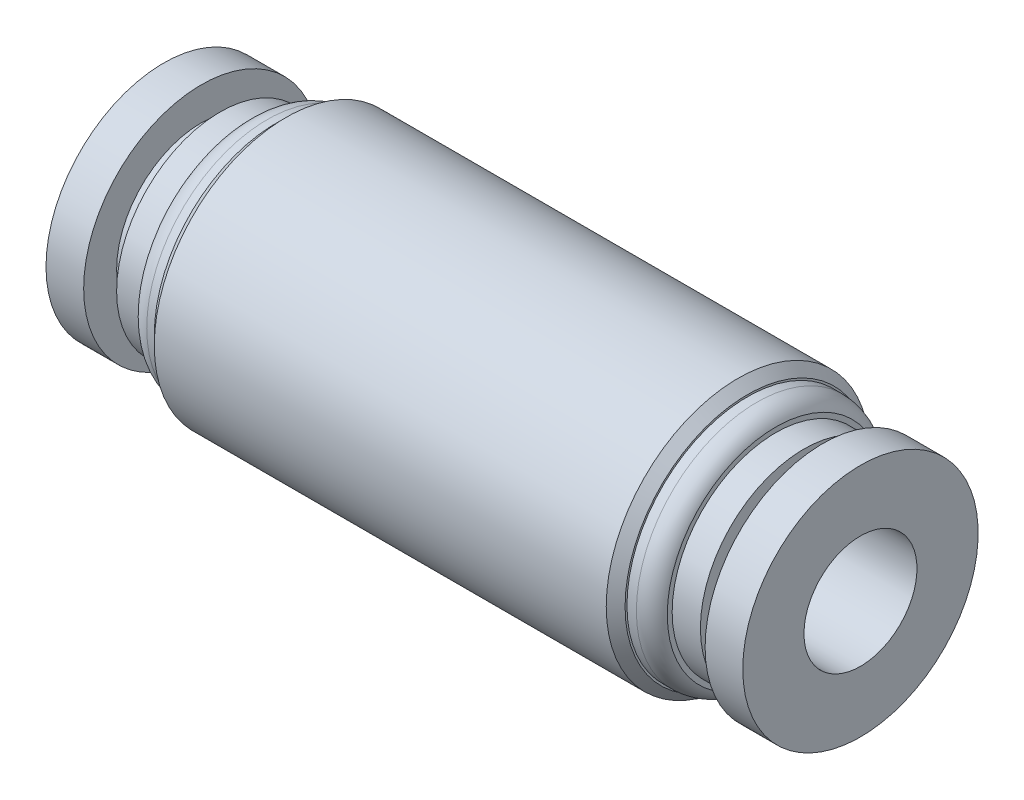
ISO-10303-21;
HEADER;
FILE_DESCRIPTION(('STEP AP214'),'2;1');
FILE_NAME('part.step','',(''),(''),'','','');
FILE_SCHEMA(('AUTOMOTIVE_DESIGN { 1 0 10303 214 1 1 1 1 }'));
ENDSEC;
DATA;
#1=APPLICATION_CONTEXT('core data for automotive mechanical design processes');
#2=APPLICATION_PROTOCOL_DEFINITION('international standard','automotive_design',2000,#1);
#3=PRODUCT_CONTEXT('',#1,'mechanical');
#4=PRODUCT('Part','Part','',(#3));
#5=PRODUCT_RELATED_PRODUCT_CATEGORY('part','',(#4));
#6=PRODUCT_DEFINITION_FORMATION('','',#4);
#7=PRODUCT_DEFINITION_CONTEXT('part definition',#1,'design');
#8=PRODUCT_DEFINITION('design','',#6,#7);
#9=PRODUCT_DEFINITION_SHAPE('','',#8);
#10=(LENGTH_UNIT() NAMED_UNIT(*) SI_UNIT(.MILLI.,.METRE.));
#11=(NAMED_UNIT(*) PLANE_ANGLE_UNIT() SI_UNIT($,.RADIAN.));
#12=(NAMED_UNIT(*) SI_UNIT($,.STERADIAN.) SOLID_ANGLE_UNIT());
#13=UNCERTAINTY_MEASURE_WITH_UNIT(LENGTH_MEASURE(1.E-05),#10,'distance_accuracy_value','');
#14=(GEOMETRIC_REPRESENTATION_CONTEXT(3) GLOBAL_UNCERTAINTY_ASSIGNED_CONTEXT((#13)) GLOBAL_UNIT_ASSIGNED_CONTEXT((#10,
#11,#12)) REPRESENTATION_CONTEXT('',''));
#15=CARTESIAN_POINT('',(0.,0.,0.));
#16=DIRECTION('',(0.,0.,1.));
#17=DIRECTION('',(1.,0.,0.));
#18=AXIS2_PLACEMENT_3D('',#15,#16,#17);
#19=CARTESIAN_POINT('',(-37.3771865118549,0.,0.));
#20=DIRECTION('',(-1.,0.,0.));
#21=DIRECTION('',(0.,0.,1.));
#22=AXIS2_PLACEMENT_3D('',#19,#20,#21);
#23=CYLINDRICAL_SURFACE('',#22,3.);
#24=CARTESIAN_POINT('',(18.5,0.,0.));
#25=DIRECTION('',(-1.,0.,0.));
#26=DIRECTION('',(0.,0.,1.));
#27=AXIS2_PLACEMENT_3D('',#24,#25,#26);
#28=CIRCLE('',#27,3.);
#29=CARTESIAN_POINT('',(18.5,0.,3.));
#30=VERTEX_POINT('',#29);
#31=EDGE_CURVE('E74',#30,#30,#28,.T.);
#32=ORIENTED_EDGE('',*,*,#31,.F.);
#33=EDGE_LOOP('',(#32));
#34=FACE_BOUND('',#33,.T.);
#35=CARTESIAN_POINT('',(-18.5,0.,0.));
#36=DIRECTION('',(-1.,0.,0.));
#37=DIRECTION('',(0.,0.,1.));
#38=AXIS2_PLACEMENT_3D('',#35,#36,#37);
#39=CIRCLE('',#38,3.);
#40=CARTESIAN_POINT('',(-18.5,0.,3.));
#41=VERTEX_POINT('',#40);
#42=EDGE_CURVE('E140',#41,#41,#39,.T.);
#43=ORIENTED_EDGE('',*,*,#42,.T.);
#44=EDGE_LOOP('',(#43));
#45=FACE_BOUND('',#44,.T.);
#46=ADVANCED_FACE('F48',(#34,#45),#23,.F.);
#47=CARTESIAN_POINT('',(18.5,0.,-6.25));
#48=DIRECTION('',(-1.,0.,0.));
#49=DIRECTION('',(0.,0.,1.));
#50=AXIS2_PLACEMENT_3D('',#47,#48,#49);
#51=PLANE('',#50);
#52=CARTESIAN_POINT('',(18.5,0.,0.));
#53=DIRECTION('',(-1.,0.,0.));
#54=DIRECTION('',(0.,0.,1.));
#55=AXIS2_PLACEMENT_3D('',#52,#53,#54);
#56=CIRCLE('',#55,6.25);
#57=CARTESIAN_POINT('',(18.5,0.,6.25));
#58=VERTEX_POINT('',#57);
#59=EDGE_CURVE('E77',#58,#58,#56,.T.);
#60=ORIENTED_EDGE('',*,*,#59,.F.);
#61=EDGE_LOOP('',(#60));
#62=FACE_BOUND('',#61,.T.);
#63=ORIENTED_EDGE('',*,*,#31,.T.);
#64=EDGE_LOOP('',(#63));
#65=FACE_BOUND('',#64,.T.);
#66=ADVANCED_FACE('F211',(#62,#65),#51,.F.);
#67=CARTESIAN_POINT('',(-37.3771865118549,0.,0.));
#68=DIRECTION('',(-1.,0.,0.));
#69=DIRECTION('',(0.,0.,1.));
#70=AXIS2_PLACEMENT_3D('',#67,#68,#69);
#71=CYLINDRICAL_SURFACE('',#70,6.25);
#72=CARTESIAN_POINT('',(16.5,0.,0.));
#73=DIRECTION('',(-1.,0.,0.));
#74=DIRECTION('',(0.,0.,1.));
#75=AXIS2_PLACEMENT_3D('',#72,#73,#74);
#76=CIRCLE('',#75,6.25);
#77=CARTESIAN_POINT('',(16.5,0.,6.25));
#78=VERTEX_POINT('',#77);
#79=EDGE_CURVE('E81',#78,#78,#76,.T.);
#80=ORIENTED_EDGE('',*,*,#79,.F.);
#81=EDGE_LOOP('',(#80));
#82=FACE_BOUND('',#81,.T.);
#83=ORIENTED_EDGE('',*,*,#59,.T.);
#84=EDGE_LOOP('',(#83));
#85=FACE_BOUND('',#84,.T.);
#86=ADVANCED_FACE('F217',(#82,#85),#71,.T.);
#87=CARTESIAN_POINT('',(16.5,0.,-4.5));
#88=DIRECTION('',(1.,0.,0.));
#89=DIRECTION('',(0.,0.,-1.));
#90=AXIS2_PLACEMENT_3D('',#87,#88,#89);
#91=PLANE('',#90);
#92=CARTESIAN_POINT('',(16.5,0.,0.));
#93=DIRECTION('',(-1.,0.,0.));
#94=DIRECTION('',(0.,0.,1.));
#95=AXIS2_PLACEMENT_3D('',#92,#93,#94);
#96=CIRCLE('',#95,4.5);
#97=CARTESIAN_POINT('',(16.5,0.,4.5));
#98=VERTEX_POINT('',#97);
#99=EDGE_CURVE('E85',#98,#98,#96,.T.);
#100=ORIENTED_EDGE('',*,*,#99,.F.);
#101=EDGE_LOOP('',(#100));
#102=FACE_BOUND('',#101,.T.);
#103=ORIENTED_EDGE('',*,*,#79,.T.);
#104=EDGE_LOOP('',(#103));
#105=FACE_BOUND('',#104,.T.);
#106=ADVANCED_FACE('F248',(#102,#105),#91,.F.);
#107=CARTESIAN_POINT('',(-37.3771865118549,0.,0.));
#108=DIRECTION('',(-1.,0.,0.));
#109=DIRECTION('',(0.,0.,1.));
#110=AXIS2_PLACEMENT_3D('',#107,#108,#109);
#111=CYLINDRICAL_SURFACE('',#110,4.5);
#112=CARTESIAN_POINT('',(15.5,0.,0.));
#113=DIRECTION('',(-1.,0.,0.));
#114=DIRECTION('',(0.,0.,1.));
#115=AXIS2_PLACEMENT_3D('',#112,#113,#114);
#116=CIRCLE('',#115,4.5);
#117=CARTESIAN_POINT('',(15.5,0.,4.5));
#118=VERTEX_POINT('',#117);
#119=EDGE_CURVE('E88',#118,#118,#116,.T.);
#120=ORIENTED_EDGE('',*,*,#119,.F.);
#121=EDGE_LOOP('',(#120));
#122=FACE_BOUND('',#121,.T.);
#123=ORIENTED_EDGE('',*,*,#99,.T.);
#124=EDGE_LOOP('',(#123));
#125=FACE_BOUND('',#124,.T.);
#126=ADVANCED_FACE('F291',(#122,#125),#111,.T.);
#127=CARTESIAN_POINT('',(15.5,0.,-5.5));
#128=DIRECTION('',(-1.,0.,0.));
#129=DIRECTION('',(0.,0.,1.));
#130=AXIS2_PLACEMENT_3D('',#127,#128,#129);
#131=PLANE('',#130);
#132=CARTESIAN_POINT('',(15.5,0.,0.));
#133=DIRECTION('',(-1.,0.,0.));
#134=DIRECTION('',(0.,0.,1.));
#135=AXIS2_PLACEMENT_3D('',#132,#133,#134);
#136=CIRCLE('',#135,5.5);
#137=CARTESIAN_POINT('',(15.5,0.,5.5));
#138=VERTEX_POINT('',#137);
#139=EDGE_CURVE('E91',#138,#138,#136,.T.);
#140=ORIENTED_EDGE('',*,*,#139,.F.);
#141=EDGE_LOOP('',(#140));
#142=FACE_BOUND('',#141,.T.);
#143=ORIENTED_EDGE('',*,*,#119,.T.);
#144=EDGE_LOOP('',(#143));
#145=FACE_BOUND('',#144,.T.);
#146=ADVANCED_FACE('F295',(#142,#145),#131,.F.);
#147=CARTESIAN_POINT('',(-37.3771865118549,0.,0.));
#148=DIRECTION('',(-1.,0.,0.));
#149=DIRECTION('',(0.,0.,1.));
#150=AXIS2_PLACEMENT_3D('',#147,#148,#149);
#151=CYLINDRICAL_SURFACE('',#150,5.5);
#152=CARTESIAN_POINT('',(14.,0.,0.));
#153=DIRECTION('',(-1.,0.,0.));
#154=DIRECTION('',(0.,0.,1.));
#155=AXIS2_PLACEMENT_3D('',#152,#153,#154);
#156=CIRCLE('',#155,5.5);
#157=CARTESIAN_POINT('',(14.,0.,5.5));
#158=VERTEX_POINT('',#157);
#159=EDGE_CURVE('E95',#158,#158,#156,.T.);
#160=ORIENTED_EDGE('',*,*,#159,.F.);
#161=EDGE_LOOP('',(#160));
#162=FACE_BOUND('',#161,.T.);
#163=ORIENTED_EDGE('',*,*,#139,.T.);
#164=EDGE_LOOP('',(#163));
#165=FACE_BOUND('',#164,.T.);
#166=ADVANCED_FACE('F328',(#162,#165),#151,.T.);
#167=CARTESIAN_POINT('',(14.,0.,-5.7582575694956));
#168=DIRECTION('',(-1.,0.,0.));
#169=DIRECTION('',(0.,0.,1.));
#170=AXIS2_PLACEMENT_3D('',#167,#168,#169);
#171=PLANE('',#170);
#172=CARTESIAN_POINT('',(14.,0.,0.));
#173=DIRECTION('',(-1.,0.,0.));
#174=DIRECTION('',(0.,0.,1.));
#175=AXIS2_PLACEMENT_3D('',#172,#173,#174);
#176=CIRCLE('',#175,5.7582575694956);
#177=CARTESIAN_POINT('',(14.,0.,5.7582575694956));
#178=VERTEX_POINT('',#177);
#179=EDGE_CURVE('E98',#178,#178,#176,.T.);
#180=ORIENTED_EDGE('',*,*,#179,.F.);
#181=EDGE_LOOP('',(#180));
#182=FACE_BOUND('',#181,.T.);
#183=ORIENTED_EDGE('',*,*,#159,.T.);
#184=EDGE_LOOP('',(#183));
#185=FACE_BOUND('',#184,.T.);
#186=ADVANCED_FACE('F270',(#182,#185),#171,.F.);
#187=CARTESIAN_POINT('',(13.,0.,0.));
#188=DIRECTION('',(-1.,0.,0.));
#189=DIRECTION('',(0.,0.,1.));
#190=AXIS2_PLACEMENT_3D('',#187,#188,#189);
#191=TOROIDAL_SURFACE('',#190,5.30000000000001,1.1);
#192=CARTESIAN_POINT('',(13.,0.,0.));
#193=DIRECTION('',(-1.,0.,0.));
#194=DIRECTION('',(0.,0.,1.));
#195=AXIS2_PLACEMENT_3D('',#192,#193,#194);
#196=CIRCLE('',#195,6.4);
#197=CARTESIAN_POINT('',(13.,0.,6.4));
#198=VERTEX_POINT('',#197);
#199=EDGE_CURVE('E102',#198,#198,#196,.T.);
#200=ORIENTED_EDGE('',*,*,#199,.F.);
#201=EDGE_LOOP('',(#200));
#202=FACE_BOUND('',#201,.T.);
#203=ORIENTED_EDGE('',*,*,#179,.T.);
#204=EDGE_LOOP('',(#203));
#205=FACE_BOUND('',#204,.T.);
#206=ADVANCED_FACE('F265',(#202,#205),#191,.T.);
#207=CARTESIAN_POINT('',(-37.3771865118549,0.,0.));
#208=DIRECTION('',(-1.,0.,0.));
#209=DIRECTION('',(0.,0.,1.));
#210=AXIS2_PLACEMENT_3D('',#207,#208,#209);
#211=CYLINDRICAL_SURFACE('',#210,6.4);
#212=CARTESIAN_POINT('',(12.5,0.,0.));
#213=DIRECTION('',(-1.,0.,0.));
#214=DIRECTION('',(0.,0.,1.));
#215=AXIS2_PLACEMENT_3D('',#212,#213,#214);
#216=CIRCLE('',#215,6.4);
#217=CARTESIAN_POINT('',(12.5,0.,6.4));
#218=VERTEX_POINT('',#217);
#219=EDGE_CURVE('E106',#218,#218,#216,.T.);
#220=ORIENTED_EDGE('',*,*,#219,.F.);
#221=EDGE_LOOP('',(#220));
#222=FACE_BOUND('',#221,.T.);
#223=ORIENTED_EDGE('',*,*,#199,.T.);
#224=EDGE_LOOP('',(#223));
#225=FACE_BOUND('',#224,.T.);
#226=ADVANCED_FACE('F269',(#222,#225),#211,.T.);
#227=CARTESIAN_POINT('',(12.5,0.,-7.));
#228=DIRECTION('',(-1.,0.,0.));
#229=DIRECTION('',(0.,0.,1.));
#230=AXIS2_PLACEMENT_3D('',#227,#228,#229);
#231=PLANE('',#230);
#232=CARTESIAN_POINT('',(12.5,0.,0.));
#233=DIRECTION('',(-1.,0.,0.));
#234=DIRECTION('',(0.,0.,1.));
#235=AXIS2_PLACEMENT_3D('',#232,#233,#234);
#236=CIRCLE('',#235,6.49999999999998);
#237=CARTESIAN_POINT('',(12.5,0.,6.49999999999998));
#238=VERTEX_POINT('',#237);
#239=EDGE_CURVE('E55',#238,#238,#236,.F.);
#240=ORIENTED_EDGE('',*,*,#239,.T.);
#241=EDGE_LOOP('',(#240));
#242=FACE_BOUND('',#241,.T.);
#243=ORIENTED_EDGE('',*,*,#219,.T.);
#244=EDGE_LOOP('',(#243));
#245=FACE_BOUND('',#244,.T.);
#246=ADVANCED_FACE('F207',(#242,#245),#231,.F.);
#247=CARTESIAN_POINT('',(-37.3771865118549,0.,0.));
#248=DIRECTION('',(-1.,0.,0.));
#249=DIRECTION('',(0.,0.,1.));
#250=AXIS2_PLACEMENT_3D('',#247,#248,#249);
#251=CYLINDRICAL_SURFACE('',#250,7.);
#252=CARTESIAN_POINT('',(12.,0.,0.));
#253=DIRECTION('',(-1.,0.,0.));
#254=DIRECTION('',(0.,0.,1.));
#255=AXIS2_PLACEMENT_3D('',#252,#253,#254);
#256=CIRCLE('',#255,7.);
#257=CARTESIAN_POINT('',(12.,0.,7.));
#258=VERTEX_POINT('',#257);
#259=EDGE_CURVE('E60',#258,#258,#256,.T.);
#260=ORIENTED_EDGE('',*,*,#259,.T.);
#261=EDGE_LOOP('',(#260));
#262=FACE_BOUND('',#261,.T.);
#263=CARTESIAN_POINT('',(-12.,0.,0.));
#264=DIRECTION('',(1.,0.,0.));
#265=DIRECTION('',(0.,0.,-1.));
#266=AXIS2_PLACEMENT_3D('',#263,#264,#265);
#267=CIRCLE('',#266,7.);
#268=CARTESIAN_POINT('',(-12.,0.,-7.));
#269=VERTEX_POINT('',#268);
#270=EDGE_CURVE('E68',#269,#269,#267,.T.);
#271=ORIENTED_EDGE('',*,*,#270,.T.);
#272=EDGE_LOOP('',(#271));
#273=FACE_BOUND('',#272,.T.);
#274=ADVANCED_FACE('F202',(#262,#273),#251,.T.);
#275=CARTESIAN_POINT('',(-12.5,0.,-7.));
#276=DIRECTION('',(1.,0.,0.));
#277=DIRECTION('',(0.,0.,-1.));
#278=AXIS2_PLACEMENT_3D('',#275,#276,#277);
#279=PLANE('',#278);
#280=CARTESIAN_POINT('',(-12.5,0.,0.));
#281=DIRECTION('',(1.,0.,0.));
#282=DIRECTION('',(0.,0.,-1.));
#283=AXIS2_PLACEMENT_3D('',#280,#281,#282);
#284=CIRCLE('',#283,6.49999999999999);
#285=CARTESIAN_POINT('',(-12.5,0.,-6.49999999999999));
#286=VERTEX_POINT('',#285);
#287=EDGE_CURVE('E12',#286,#286,#284,.F.);
#288=ORIENTED_EDGE('',*,*,#287,.T.);
#289=EDGE_LOOP('',(#288));
#290=FACE_BOUND('',#289,.T.);
#291=CARTESIAN_POINT('',(-12.5,0.,0.));
#292=DIRECTION('',(-1.,0.,0.));
#293=DIRECTION('',(0.,0.,1.));
#294=AXIS2_PLACEMENT_3D('',#291,#292,#293);
#295=CIRCLE('',#294,6.4);
#296=CARTESIAN_POINT('',(-12.5,0.,6.4));
#297=VERTEX_POINT('',#296);
#298=EDGE_CURVE('E109',#297,#297,#295,.T.);
#299=ORIENTED_EDGE('',*,*,#298,.F.);
#300=EDGE_LOOP('',(#299));
#301=FACE_BOUND('',#300,.T.);
#302=ADVANCED_FACE('F197',(#290,#301),#279,.F.);
#303=CARTESIAN_POINT('',(-37.3771865118549,0.,0.));
#304=DIRECTION('',(-1.,0.,0.));
#305=DIRECTION('',(0.,0.,1.));
#306=AXIS2_PLACEMENT_3D('',#303,#304,#305);
#307=CYLINDRICAL_SURFACE('',#306,6.4);
#308=CARTESIAN_POINT('',(-13.,0.,0.));
#309=DIRECTION('',(-1.,0.,0.));
#310=DIRECTION('',(0.,0.,1.));
#311=AXIS2_PLACEMENT_3D('',#308,#309,#310);
#312=CIRCLE('',#311,6.4);
#313=CARTESIAN_POINT('',(-13.,0.,6.4));
#314=VERTEX_POINT('',#313);
#315=EDGE_CURVE('E112',#314,#314,#312,.T.);
#316=ORIENTED_EDGE('',*,*,#315,.F.);
#317=EDGE_LOOP('',(#316));
#318=FACE_BOUND('',#317,.T.);
#319=ORIENTED_EDGE('',*,*,#298,.T.);
#320=EDGE_LOOP('',(#319));
#321=FACE_BOUND('',#320,.T.);
#322=ADVANCED_FACE('F191',(#318,#321),#307,.T.);
#323=CARTESIAN_POINT('',(-13.,0.,0.));
#324=DIRECTION('',(-1.,0.,0.));
#325=DIRECTION('',(0.,0.,1.));
#326=AXIS2_PLACEMENT_3D('',#323,#324,#325);
#327=TOROIDAL_SURFACE('',#326,5.3,1.1);
#328=CARTESIAN_POINT('',(-14.,0.,0.));
#329=DIRECTION('',(-1.,0.,0.));
#330=DIRECTION('',(0.,0.,1.));
#331=AXIS2_PLACEMENT_3D('',#328,#329,#330);
#332=CIRCLE('',#331,5.7582575694956);
#333=CARTESIAN_POINT('',(-14.,0.,5.7582575694956));
#334=VERTEX_POINT('',#333);
#335=EDGE_CURVE('E116',#334,#334,#332,.T.);
#336=ORIENTED_EDGE('',*,*,#335,.F.);
#337=EDGE_LOOP('',(#336));
#338=FACE_BOUND('',#337,.T.);
#339=ORIENTED_EDGE('',*,*,#315,.T.);
#340=EDGE_LOOP('',(#339));
#341=FACE_BOUND('',#340,.T.);
#342=ADVANCED_FACE('F185',(#338,#341),#327,.T.);
#343=CARTESIAN_POINT('',(-14.,0.,-5.7582575694956));
#344=DIRECTION('',(1.,0.,0.));
#345=DIRECTION('',(0.,0.,-1.));
#346=AXIS2_PLACEMENT_3D('',#343,#344,#345);
#347=PLANE('',#346);
#348=CARTESIAN_POINT('',(-14.,0.,0.));
#349=DIRECTION('',(-1.,0.,0.));
#350=DIRECTION('',(0.,0.,1.));
#351=AXIS2_PLACEMENT_3D('',#348,#349,#350);
#352=CIRCLE('',#351,5.49999999999999);
#353=CARTESIAN_POINT('',(-14.,0.,5.49999999999999));
#354=VERTEX_POINT('',#353);
#355=EDGE_CURVE('E120',#354,#354,#352,.T.);
#356=ORIENTED_EDGE('',*,*,#355,.F.);
#357=EDGE_LOOP('',(#356));
#358=FACE_BOUND('',#357,.T.);
#359=ORIENTED_EDGE('',*,*,#335,.T.);
#360=EDGE_LOOP('',(#359));
#361=FACE_BOUND('',#360,.T.);
#362=ADVANCED_FACE('F179',(#358,#361),#347,.F.);
#363=CARTESIAN_POINT('',(-37.3771865118549,0.,0.));
#364=DIRECTION('',(-1.,0.,0.));
#365=DIRECTION('',(0.,0.,1.));
#366=AXIS2_PLACEMENT_3D('',#363,#364,#365);
#367=CYLINDRICAL_SURFACE('',#366,5.49999999999999);
#368=CARTESIAN_POINT('',(-15.5,0.,0.));
#369=DIRECTION('',(-1.,0.,0.));
#370=DIRECTION('',(0.,0.,1.));
#371=AXIS2_PLACEMENT_3D('',#368,#369,#370);
#372=CIRCLE('',#371,5.49999999999999);
#373=CARTESIAN_POINT('',(-15.5,0.,5.49999999999999));
#374=VERTEX_POINT('',#373);
#375=EDGE_CURVE('E123',#374,#374,#372,.T.);
#376=ORIENTED_EDGE('',*,*,#375,.F.);
#377=EDGE_LOOP('',(#376));
#378=FACE_BOUND('',#377,.T.);
#379=ORIENTED_EDGE('',*,*,#355,.T.);
#380=EDGE_LOOP('',(#379));
#381=FACE_BOUND('',#380,.T.);
#382=ADVANCED_FACE('F173',(#378,#381),#367,.T.);
#383=CARTESIAN_POINT('',(-15.5,0.,-5.49999999999999));
#384=DIRECTION('',(1.,0.,0.));
#385=DIRECTION('',(0.,0.,-1.));
#386=AXIS2_PLACEMENT_3D('',#383,#384,#385);
#387=PLANE('',#386);
#388=CARTESIAN_POINT('',(-15.5,0.,0.));
#389=DIRECTION('',(-1.,0.,0.));
#390=DIRECTION('',(0.,0.,1.));
#391=AXIS2_PLACEMENT_3D('',#388,#389,#390);
#392=CIRCLE('',#391,4.49999999999999);
#393=CARTESIAN_POINT('',(-15.5,0.,4.49999999999999));
#394=VERTEX_POINT('',#393);
#395=EDGE_CURVE('E126',#394,#394,#392,.T.);
#396=ORIENTED_EDGE('',*,*,#395,.F.);
#397=EDGE_LOOP('',(#396));
#398=FACE_BOUND('',#397,.T.);
#399=ORIENTED_EDGE('',*,*,#375,.T.);
#400=EDGE_LOOP('',(#399));
#401=FACE_BOUND('',#400,.T.);
#402=ADVANCED_FACE('F167',(#398,#401),#387,.F.);
#403=CARTESIAN_POINT('',(-37.3771865118549,0.,0.));
#404=DIRECTION('',(-1.,0.,0.));
#405=DIRECTION('',(0.,0.,1.));
#406=AXIS2_PLACEMENT_3D('',#403,#404,#405);
#407=CYLINDRICAL_SURFACE('',#406,4.49999999999999);
#408=CARTESIAN_POINT('',(-16.5,0.,0.));
#409=DIRECTION('',(-1.,0.,0.));
#410=DIRECTION('',(0.,0.,1.));
#411=AXIS2_PLACEMENT_3D('',#408,#409,#410);
#412=CIRCLE('',#411,4.49999999999999);
#413=CARTESIAN_POINT('',(-16.5,0.,4.49999999999999));
#414=VERTEX_POINT('',#413);
#415=EDGE_CURVE('E129',#414,#414,#412,.T.);
#416=ORIENTED_EDGE('',*,*,#415,.F.);
#417=EDGE_LOOP('',(#416));
#418=FACE_BOUND('',#417,.T.);
#419=ORIENTED_EDGE('',*,*,#395,.T.);
#420=EDGE_LOOP('',(#419));
#421=FACE_BOUND('',#420,.T.);
#422=ADVANCED_FACE('F161',(#418,#421),#407,.T.);
#423=CARTESIAN_POINT('',(-16.5,0.,-4.49999999999999));
#424=DIRECTION('',(-1.,0.,0.));
#425=DIRECTION('',(0.,0.,1.));
#426=AXIS2_PLACEMENT_3D('',#423,#424,#425);
#427=PLANE('',#426);
#428=CARTESIAN_POINT('',(-16.5,0.,0.));
#429=DIRECTION('',(-1.,0.,0.));
#430=DIRECTION('',(0.,0.,1.));
#431=AXIS2_PLACEMENT_3D('',#428,#429,#430);
#432=CIRCLE('',#431,6.25);
#433=CARTESIAN_POINT('',(-16.5,0.,6.25));
#434=VERTEX_POINT('',#433);
#435=EDGE_CURVE('E132',#434,#434,#432,.T.);
#436=ORIENTED_EDGE('',*,*,#435,.F.);
#437=EDGE_LOOP('',(#436));
#438=FACE_BOUND('',#437,.T.);
#439=ORIENTED_EDGE('',*,*,#415,.T.);
#440=EDGE_LOOP('',(#439));
#441=FACE_BOUND('',#440,.T.);
#442=ADVANCED_FACE('F155',(#438,#441),#427,.F.);
#443=CARTESIAN_POINT('',(-37.3771865118549,0.,0.));
#444=DIRECTION('',(-1.,0.,0.));
#445=DIRECTION('',(0.,0.,1.));
#446=AXIS2_PLACEMENT_3D('',#443,#444,#445);
#447=CYLINDRICAL_SURFACE('',#446,6.25);
#448=CARTESIAN_POINT('',(-18.5,0.,0.));
#449=DIRECTION('',(-1.,0.,0.));
#450=DIRECTION('',(0.,0.,1.));
#451=AXIS2_PLACEMENT_3D('',#448,#449,#450);
#452=CIRCLE('',#451,6.25);
#453=CARTESIAN_POINT('',(-18.5,0.,6.25));
#454=VERTEX_POINT('',#453);
#455=EDGE_CURVE('E136',#454,#454,#452,.T.);
#456=ORIENTED_EDGE('',*,*,#455,.F.);
#457=EDGE_LOOP('',(#456));
#458=FACE_BOUND('',#457,.T.);
#459=ORIENTED_EDGE('',*,*,#435,.T.);
#460=EDGE_LOOP('',(#459));
#461=FACE_BOUND('',#460,.T.);
#462=ADVANCED_FACE('F149',(#458,#461),#447,.T.);
#463=CARTESIAN_POINT('',(-18.5,0.,-6.25));
#464=DIRECTION('',(1.,0.,0.));
#465=DIRECTION('',(0.,0.,-1.));
#466=AXIS2_PLACEMENT_3D('',#463,#464,#465);
#467=PLANE('',#466);
#468=ORIENTED_EDGE('',*,*,#42,.F.);
#469=EDGE_LOOP('',(#468));
#470=FACE_BOUND('',#469,.T.);
#471=ORIENTED_EDGE('',*,*,#455,.T.);
#472=EDGE_LOOP('',(#471));
#473=FACE_BOUND('',#472,.T.);
#474=ADVANCED_FACE('F145',(#470,#473),#467,.F.);
#475=CARTESIAN_POINT('',(12.,0.,0.));
#476=DIRECTION('',(-1.,0.,0.));
#477=DIRECTION('',(0.,0.,1.));
#478=AXIS2_PLACEMENT_3D('',#475,#476,#477);
#479=CONICAL_SURFACE('',#478,7.,0.785398163397453);
#480=ORIENTED_EDGE('',*,*,#239,.F.);
#481=EDGE_LOOP('',(#480));
#482=FACE_BOUND('',#481,.T.);
#483=ORIENTED_EDGE('',*,*,#259,.F.);
#484=EDGE_LOOP('',(#483));
#485=FACE_BOUND('',#484,.T.);
#486=ADVANCED_FACE('F148',(#482,#485),#479,.T.);
#487=CARTESIAN_POINT('',(-12.5,0.,0.));
#488=DIRECTION('',(1.,0.,0.));
#489=DIRECTION('',(0.,0.,-1.));
#490=AXIS2_PLACEMENT_3D('',#487,#488,#489);
#491=CONICAL_SURFACE('',#490,6.49999999999999,0.785398163397442);
#492=ORIENTED_EDGE('',*,*,#270,.F.);
#493=EDGE_LOOP('',(#492));
#494=FACE_BOUND('',#493,.T.);
#495=ORIENTED_EDGE('',*,*,#287,.F.);
#496=EDGE_LOOP('',(#495));
#497=FACE_BOUND('',#496,.T.);
#498=ADVANCED_FACE('F50',(#494,#497),#491,.T.);
#499=CLOSED_SHELL('',(#46,#66,#86,#106,#126,#146,#166,#186,#206,#226,#246,#274,#302,#322,#342,
#362,#382,#402,#422,#442,#462,#474,#486,#498));
#500=MANIFOLD_SOLID_BREP('B2',#499);
#501=ADVANCED_BREP_SHAPE_REPRESENTATION('',(#18,#500),#14);
#502=SHAPE_DEFINITION_REPRESENTATION(#9,#501);
ENDSEC;
END-ISO-10303-21;
